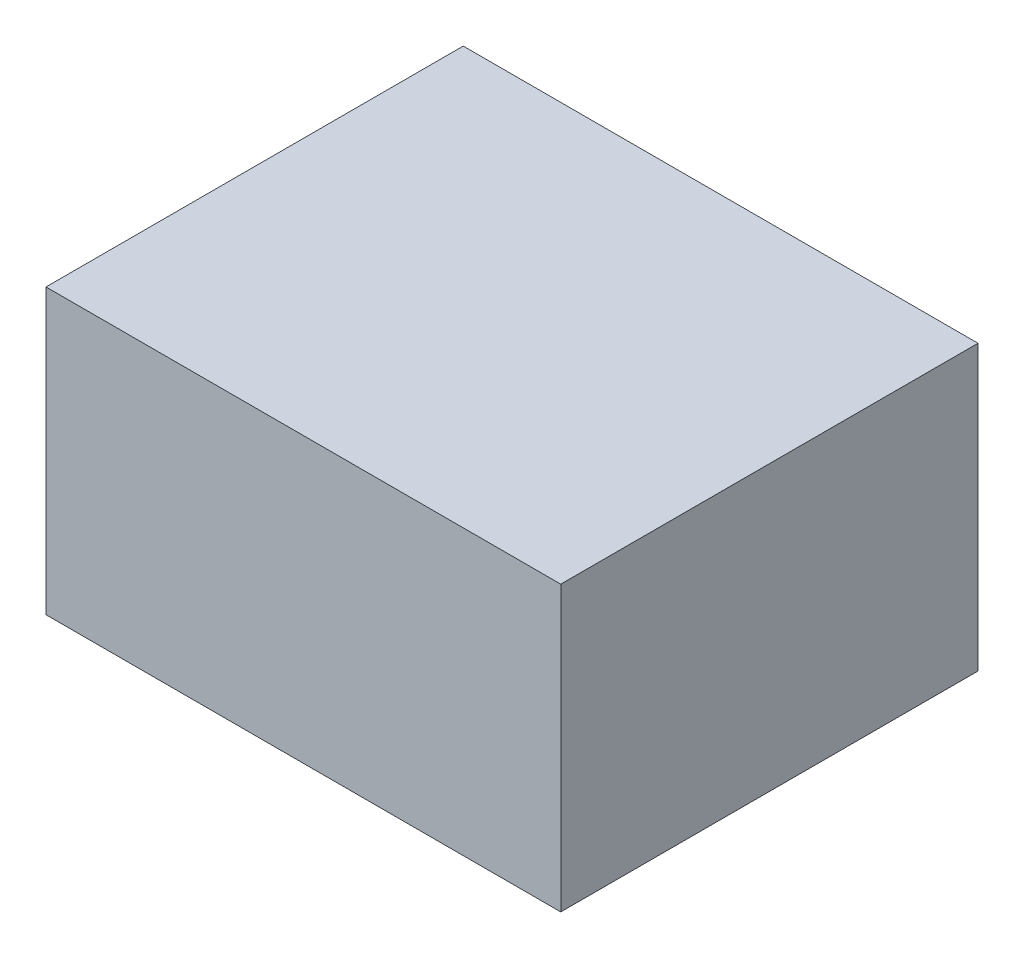
ISO-10303-21;
HEADER;
FILE_DESCRIPTION(('STEP AP214'),'2;1');
FILE_NAME('part.step','',(''),(''),'','','');
FILE_SCHEMA(('AUTOMOTIVE_DESIGN { 1 0 10303 214 1 1 1 1 }'));
ENDSEC;
DATA;
#1=APPLICATION_CONTEXT('core data for automotive mechanical design processes');
#2=APPLICATION_PROTOCOL_DEFINITION('international standard','automotive_design',2000,#1);
#3=PRODUCT_CONTEXT('',#1,'mechanical');
#4=PRODUCT('Part','Part','',(#3));
#5=PRODUCT_RELATED_PRODUCT_CATEGORY('part','',(#4));
#6=PRODUCT_DEFINITION_FORMATION('','',#4);
#7=PRODUCT_DEFINITION_CONTEXT('part definition',#1,'design');
#8=PRODUCT_DEFINITION('design','',#6,#7);
#9=PRODUCT_DEFINITION_SHAPE('','',#8);
#10=(LENGTH_UNIT() NAMED_UNIT(*) SI_UNIT(.MILLI.,.METRE.));
#11=(NAMED_UNIT(*) PLANE_ANGLE_UNIT() SI_UNIT($,.RADIAN.));
#12=(NAMED_UNIT(*) SI_UNIT($,.STERADIAN.) SOLID_ANGLE_UNIT());
#13=UNCERTAINTY_MEASURE_WITH_UNIT(LENGTH_MEASURE(1.E-05),#10,'distance_accuracy_value','');
#14=(GEOMETRIC_REPRESENTATION_CONTEXT(3) GLOBAL_UNCERTAINTY_ASSIGNED_CONTEXT((#13)) GLOBAL_UNIT_ASSIGNED_CONTEXT((#10,
#11,#12)) REPRESENTATION_CONTEXT('',''));
#15=CARTESIAN_POINT('',(0.,0.,0.));
#16=DIRECTION('',(0.,0.,1.));
#17=DIRECTION('',(1.,0.,0.));
#18=AXIS2_PLACEMENT_3D('',#15,#16,#17);
#19=CARTESIAN_POINT('',(-172.72,190.5,-140.));
#20=DIRECTION('',(1.,0.,0.));
#21=DIRECTION('',(0.,0.,-1.));
#22=AXIS2_PLACEMENT_3D('',#19,#20,#21);
#23=PLANE('',#22);
#24=DIRECTION('',(0.,0.,1.));
#25=VECTOR('',#24,1.);
#26=CARTESIAN_POINT('',(-172.72,0.,-140.));
#27=LINE('',#26,#25);
#28=CARTESIAN_POINT('',(-172.72,0.,-140.));
#29=VERTEX_POINT('',#28);
#30=CARTESIAN_POINT('',(-172.72,0.,140.));
#31=VERTEX_POINT('',#30);
#32=EDGE_CURVE('E100',#29,#31,#27,.T.);
#33=ORIENTED_EDGE('',*,*,#32,.T.);
#34=DIRECTION('',(0.,-1.,0.));
#35=VECTOR('',#34,1.);
#36=CARTESIAN_POINT('',(-172.72,190.5,140.));
#37=LINE('',#36,#35);
#38=CARTESIAN_POINT('',(-172.72,190.5,140.));
#39=VERTEX_POINT('',#38);
#40=EDGE_CURVE('E11',#39,#31,#37,.T.);
#41=ORIENTED_EDGE('',*,*,#40,.F.);
#42=DIRECTION('',(0.,0.,1.));
#43=VECTOR('',#42,1.);
#44=CARTESIAN_POINT('',(-172.72,190.5,-140.));
#45=LINE('',#44,#43);
#46=CARTESIAN_POINT('',(-172.72,190.5,-140.));
#47=VERTEX_POINT('',#46);
#48=EDGE_CURVE('E88',#47,#39,#45,.T.);
#49=ORIENTED_EDGE('',*,*,#48,.F.);
#50=DIRECTION('',(0.,-1.,0.));
#51=VECTOR('',#50,1.);
#52=CARTESIAN_POINT('',(-172.72,190.5,-140.));
#53=LINE('',#52,#51);
#54=EDGE_CURVE('E96',#47,#29,#53,.T.);
#55=ORIENTED_EDGE('',*,*,#54,.T.);
#56=EDGE_LOOP('',(#33,#41,#49,#55));
#57=FACE_BOUND('',#56,.T.);
#58=ADVANCED_FACE('F37',(#57),#23,.F.);
#59=CARTESIAN_POINT('',(172.72,190.5,140.));
#60=DIRECTION('',(0.,0.,-1.));
#61=DIRECTION('',(-1.,0.,0.));
#62=AXIS2_PLACEMENT_3D('',#59,#60,#61);
#63=PLANE('',#62);
#64=DIRECTION('',(1.,0.,0.));
#65=VECTOR('',#64,1.);
#66=CARTESIAN_POINT('',(172.72,0.,140.));
#67=LINE('',#66,#65);
#68=CARTESIAN_POINT('',(172.72,0.,140.));
#69=VERTEX_POINT('',#68);
#70=EDGE_CURVE('E92',#31,#69,#67,.T.);
#71=ORIENTED_EDGE('',*,*,#70,.T.);
#72=DIRECTION('',(0.,-1.,0.));
#73=VECTOR('',#72,1.);
#74=CARTESIAN_POINT('',(172.72,190.5,140.));
#75=LINE('',#74,#73);
#76=CARTESIAN_POINT('',(172.72,190.5,140.));
#77=VERTEX_POINT('',#76);
#78=EDGE_CURVE('E45',#77,#69,#75,.T.);
#79=ORIENTED_EDGE('',*,*,#78,.F.);
#80=DIRECTION('',(1.,0.,0.));
#81=VECTOR('',#80,1.);
#82=CARTESIAN_POINT('',(172.72,190.5,140.));
#83=LINE('',#82,#81);
#84=EDGE_CURVE('E83',#39,#77,#83,.T.);
#85=ORIENTED_EDGE('',*,*,#84,.F.);
#86=ORIENTED_EDGE('',*,*,#40,.T.);
#87=EDGE_LOOP('',(#71,#79,#85,#86));
#88=FACE_BOUND('',#87,.T.);
#89=ADVANCED_FACE('F91',(#88),#63,.F.);
#90=CARTESIAN_POINT('',(172.72,190.5,-140.));
#91=DIRECTION('',(-1.,0.,0.));
#92=DIRECTION('',(0.,0.,1.));
#93=AXIS2_PLACEMENT_3D('',#90,#91,#92);
#94=PLANE('',#93);
#95=DIRECTION('',(0.,0.,-1.));
#96=VECTOR('',#95,1.);
#97=CARTESIAN_POINT('',(172.72,0.,-140.));
#98=LINE('',#97,#96);
#99=CARTESIAN_POINT('',(172.72,0.,-140.));
#100=VERTEX_POINT('',#99);
#101=EDGE_CURVE('E70',#69,#100,#98,.T.);
#102=ORIENTED_EDGE('',*,*,#101,.T.);
#103=DIRECTION('',(0.,-1.,0.));
#104=VECTOR('',#103,1.);
#105=CARTESIAN_POINT('',(172.72,190.5,-140.));
#106=LINE('',#105,#104);
#107=CARTESIAN_POINT('',(172.72,190.5,-140.));
#108=VERTEX_POINT('',#107);
#109=EDGE_CURVE('E93',#108,#100,#106,.T.);
#110=ORIENTED_EDGE('',*,*,#109,.F.);
#111=DIRECTION('',(0.,0.,-1.));
#112=VECTOR('',#111,1.);
#113=CARTESIAN_POINT('',(172.72,190.5,-140.));
#114=LINE('',#113,#112);
#115=EDGE_CURVE('E86',#77,#108,#114,.T.);
#116=ORIENTED_EDGE('',*,*,#115,.F.);
#117=ORIENTED_EDGE('',*,*,#78,.T.);
#118=EDGE_LOOP('',(#102,#110,#116,#117));
#119=FACE_BOUND('',#118,.T.);
#120=ADVANCED_FACE('F94',(#119),#94,.F.);
#121=CARTESIAN_POINT('',(172.72,190.5,-140.));
#122=DIRECTION('',(0.,0.,1.));
#123=DIRECTION('',(1.,0.,0.));
#124=AXIS2_PLACEMENT_3D('',#121,#122,#123);
#125=PLANE('',#124);
#126=DIRECTION('',(-1.,0.,0.));
#127=VECTOR('',#126,1.);
#128=CARTESIAN_POINT('',(172.72,0.,-140.));
#129=LINE('',#128,#127);
#130=EDGE_CURVE('E76',#100,#29,#129,.T.);
#131=ORIENTED_EDGE('',*,*,#130,.T.);
#132=ORIENTED_EDGE('',*,*,#54,.F.);
#133=DIRECTION('',(-1.,0.,0.));
#134=VECTOR('',#133,1.);
#135=CARTESIAN_POINT('',(172.72,190.5,-140.));
#136=LINE('',#135,#134);
#137=EDGE_CURVE('E53',#108,#47,#136,.T.);
#138=ORIENTED_EDGE('',*,*,#137,.F.);
#139=ORIENTED_EDGE('',*,*,#109,.T.);
#140=EDGE_LOOP('',(#131,#132,#138,#139));
#141=FACE_BOUND('',#140,.T.);
#142=ADVANCED_FACE('F107',(#141),#125,.F.);
#143=CARTESIAN_POINT('',(0.,190.5,0.));
#144=DIRECTION('',(0.,-1.,0.));
#145=DIRECTION('',(0.,0.,-1.));
#146=AXIS2_PLACEMENT_3D('',#143,#144,#145);
#147=PLANE('',#146);
#148=ORIENTED_EDGE('',*,*,#48,.T.);
#149=ORIENTED_EDGE('',*,*,#84,.T.);
#150=ORIENTED_EDGE('',*,*,#115,.T.);
#151=ORIENTED_EDGE('',*,*,#137,.T.);
#152=EDGE_LOOP('',(#148,#149,#150,#151));
#153=FACE_BOUND('',#152,.T.);
#154=ADVANCED_FACE('F84',(#153),#147,.F.);
#155=CARTESIAN_POINT('',(0.,0.,0.));
#156=DIRECTION('',(0.,-1.,0.));
#157=DIRECTION('',(0.,0.,-1.));
#158=AXIS2_PLACEMENT_3D('',#155,#156,#157);
#159=PLANE('',#158);
#160=ORIENTED_EDGE('',*,*,#32,.F.);
#161=ORIENTED_EDGE('',*,*,#130,.F.);
#162=ORIENTED_EDGE('',*,*,#101,.F.);
#163=ORIENTED_EDGE('',*,*,#70,.F.);
#164=EDGE_LOOP('',(#160,#161,#162,#163));
#165=FACE_BOUND('',#164,.T.);
#166=ADVANCED_FACE('F110',(#165),#159,.T.);
#167=CLOSED_SHELL('',(#58,#89,#120,#142,#154,#166));
#168=MANIFOLD_SOLID_BREP('B2',#167);
#169=ADVANCED_BREP_SHAPE_REPRESENTATION('',(#18,#168),#14);
#170=SHAPE_DEFINITION_REPRESENTATION(#9,#169);
ENDSEC;
END-ISO-10303-21;
